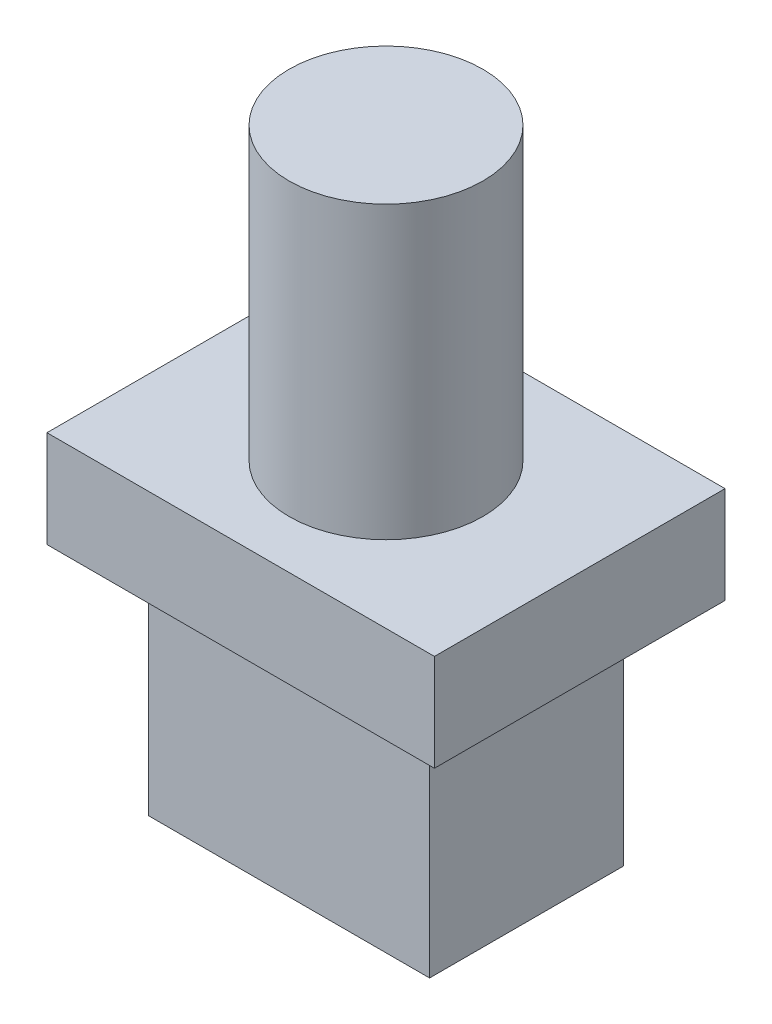
ISO-10303-21;
HEADER;
FILE_DESCRIPTION(('STEP AP214'),'2;1');
FILE_NAME('part.step','',(''),(''),'','','');
FILE_SCHEMA(('AUTOMOTIVE_DESIGN { 1 0 10303 214 1 1 1 1 }'));
ENDSEC;
DATA;
#1=APPLICATION_CONTEXT('core data for automotive mechanical design processes');
#2=APPLICATION_PROTOCOL_DEFINITION('international standard','automotive_design',2000,#1);
#3=PRODUCT_CONTEXT('',#1,'mechanical');
#4=PRODUCT('Part','Part','',(#3));
#5=PRODUCT_RELATED_PRODUCT_CATEGORY('part','',(#4));
#6=PRODUCT_DEFINITION_FORMATION('','',#4);
#7=PRODUCT_DEFINITION_CONTEXT('part definition',#1,'design');
#8=PRODUCT_DEFINITION('design','',#6,#7);
#9=PRODUCT_DEFINITION_SHAPE('','',#8);
#10=(LENGTH_UNIT() NAMED_UNIT(*) SI_UNIT(.MILLI.,.METRE.));
#11=(NAMED_UNIT(*) PLANE_ANGLE_UNIT() SI_UNIT($,.RADIAN.));
#12=(NAMED_UNIT(*) SI_UNIT($,.STERADIAN.) SOLID_ANGLE_UNIT());
#13=UNCERTAINTY_MEASURE_WITH_UNIT(LENGTH_MEASURE(1.E-05),#10,'distance_accuracy_value','');
#14=(GEOMETRIC_REPRESENTATION_CONTEXT(3) GLOBAL_UNCERTAINTY_ASSIGNED_CONTEXT((#13)) GLOBAL_UNIT_ASSIGNED_CONTEXT((#10,
#11,#12)) REPRESENTATION_CONTEXT('',''));
#15=CARTESIAN_POINT('',(0.,0.,0.));
#16=DIRECTION('',(0.,0.,1.));
#17=DIRECTION('',(1.,0.,0.));
#18=AXIS2_PLACEMENT_3D('',#15,#16,#17);
#19=CARTESIAN_POINT('',(0.,24.,-20.));
#20=DIRECTION('',(1.,0.,0.));
#21=DIRECTION('',(0.,0.,-1.));
#22=AXIS2_PLACEMENT_3D('',#19,#20,#21);
#23=PLANE('',#22);
#24=DIRECTION('',(0.,0.,1.));
#25=VECTOR('',#24,1.);
#26=CARTESIAN_POINT('',(0.,0.,-20.));
#27=LINE('',#26,#25);
#28=CARTESIAN_POINT('',(0.,0.,-20.));
#29=VERTEX_POINT('',#28);
#30=CARTESIAN_POINT('',(0.,0.,0.));
#31=VERTEX_POINT('',#30);
#32=EDGE_CURVE('E139',#29,#31,#27,.T.);
#33=ORIENTED_EDGE('',*,*,#32,.T.);
#34=DIRECTION('',(0.,-1.,0.));
#35=VECTOR('',#34,1.);
#36=CARTESIAN_POINT('',(0.,24.,0.));
#37=LINE('',#36,#35);
#38=CARTESIAN_POINT('',(0.,24.,0.));
#39=VERTEX_POINT('',#38);
#40=EDGE_CURVE('E42',#39,#31,#37,.T.);
#41=ORIENTED_EDGE('',*,*,#40,.F.);
#42=DIRECTION('',(0.,0.,1.));
#43=VECTOR('',#42,1.);
#44=CARTESIAN_POINT('',(0.,24.,-20.));
#45=LINE('',#44,#43);
#46=CARTESIAN_POINT('',(0.,24.,-20.));
#47=VERTEX_POINT('',#46);
#48=EDGE_CURVE('E148',#47,#39,#45,.T.);
#49=ORIENTED_EDGE('',*,*,#48,.F.);
#50=DIRECTION('',(0.,-1.,0.));
#51=VECTOR('',#50,1.);
#52=CARTESIAN_POINT('',(0.,24.,-20.));
#53=LINE('',#52,#51);
#54=EDGE_CURVE('E157',#47,#29,#53,.T.);
#55=ORIENTED_EDGE('',*,*,#54,.T.);
#56=EDGE_LOOP('',(#33,#41,#49,#55));
#57=FACE_BOUND('',#56,.T.);
#58=ADVANCED_FACE('F39',(#57),#23,.F.);
#59=CARTESIAN_POINT('',(0.,24.,0.));
#60=DIRECTION('',(0.,0.,-1.));
#61=DIRECTION('',(-1.,0.,0.));
#62=AXIS2_PLACEMENT_3D('',#59,#60,#61);
#63=PLANE('',#62);
#64=DIRECTION('',(1.,0.,0.));
#65=VECTOR('',#64,1.);
#66=CARTESIAN_POINT('',(0.,0.,0.));
#67=LINE('',#66,#65);
#68=CARTESIAN_POINT('',(29.,0.,0.));
#69=VERTEX_POINT('',#68);
#70=EDGE_CURVE('E142',#31,#69,#67,.T.);
#71=ORIENTED_EDGE('',*,*,#70,.T.);
#72=DIRECTION('',(0.,-1.,0.));
#73=VECTOR('',#72,1.);
#74=CARTESIAN_POINT('',(29.,24.,0.));
#75=LINE('',#74,#73);
#76=CARTESIAN_POINT('',(29.,24.,0.));
#77=VERTEX_POINT('',#76);
#78=EDGE_CURVE('E163',#77,#69,#75,.T.);
#79=ORIENTED_EDGE('',*,*,#78,.F.);
#80=DIRECTION('',(1.,0.,0.));
#81=VECTOR('',#80,1.);
#82=CARTESIAN_POINT('',(0.,24.,0.));
#83=LINE('',#82,#81);
#84=EDGE_CURVE('E83',#39,#77,#83,.T.);
#85=ORIENTED_EDGE('',*,*,#84,.F.);
#86=ORIENTED_EDGE('',*,*,#40,.T.);
#87=EDGE_LOOP('',(#71,#79,#85,#86));
#88=FACE_BOUND('',#87,.T.);
#89=ADVANCED_FACE('F164',(#88),#63,.F.);
#90=CARTESIAN_POINT('',(29.,24.,0.));
#91=DIRECTION('',(-1.,0.,0.));
#92=DIRECTION('',(0.,0.,1.));
#93=AXIS2_PLACEMENT_3D('',#90,#91,#92);
#94=PLANE('',#93);
#95=DIRECTION('',(0.,0.,-1.));
#96=VECTOR('',#95,1.);
#97=CARTESIAN_POINT('',(29.,0.,0.));
#98=LINE('',#97,#96);
#99=CARTESIAN_POINT('',(29.,0.,-20.));
#100=VERTEX_POINT('',#99);
#101=EDGE_CURVE('E72',#69,#100,#98,.T.);
#102=ORIENTED_EDGE('',*,*,#101,.T.);
#103=DIRECTION('',(0.,-1.,0.));
#104=VECTOR('',#103,1.);
#105=CARTESIAN_POINT('',(29.,24.,-20.));
#106=LINE('',#105,#104);
#107=CARTESIAN_POINT('',(29.,24.,-20.));
#108=VERTEX_POINT('',#107);
#109=EDGE_CURVE('E56',#108,#100,#106,.T.);
#110=ORIENTED_EDGE('',*,*,#109,.F.);
#111=DIRECTION('',(0.,0.,-1.));
#112=VECTOR('',#111,1.);
#113=CARTESIAN_POINT('',(29.,24.,0.));
#114=LINE('',#113,#112);
#115=EDGE_CURVE('E152',#77,#108,#114,.T.);
#116=ORIENTED_EDGE('',*,*,#115,.F.);
#117=ORIENTED_EDGE('',*,*,#78,.T.);
#118=EDGE_LOOP('',(#102,#110,#116,#117));
#119=FACE_BOUND('',#118,.T.);
#120=ADVANCED_FACE('F179',(#119),#94,.F.);
#121=CARTESIAN_POINT('',(29.,24.,-20.));
#122=DIRECTION('',(0.,0.,1.));
#123=DIRECTION('',(1.,0.,0.));
#124=AXIS2_PLACEMENT_3D('',#121,#122,#123);
#125=PLANE('',#124);
#126=DIRECTION('',(-1.,0.,0.));
#127=VECTOR('',#126,1.);
#128=CARTESIAN_POINT('',(29.,0.,-20.));
#129=LINE('',#128,#127);
#130=EDGE_CURVE('E77',#100,#29,#129,.T.);
#131=ORIENTED_EDGE('',*,*,#130,.T.);
#132=ORIENTED_EDGE('',*,*,#54,.F.);
#133=DIRECTION('',(-1.,0.,0.));
#134=VECTOR('',#133,1.);
#135=CARTESIAN_POINT('',(29.,24.,-20.));
#136=LINE('',#135,#134);
#137=EDGE_CURVE('E155',#108,#47,#136,.T.);
#138=ORIENTED_EDGE('',*,*,#137,.F.);
#139=ORIENTED_EDGE('',*,*,#109,.T.);
#140=EDGE_LOOP('',(#131,#132,#138,#139));
#141=FACE_BOUND('',#140,.T.);
#142=ADVANCED_FACE('F171',(#141),#125,.F.);
#143=CARTESIAN_POINT('',(0.,0.,0.));
#144=DIRECTION('',(0.,1.,0.));
#145=DIRECTION('',(0.,0.,1.));
#146=AXIS2_PLACEMENT_3D('',#143,#144,#145);
#147=PLANE('',#146);
#148=ORIENTED_EDGE('',*,*,#32,.F.);
#149=ORIENTED_EDGE('',*,*,#130,.F.);
#150=ORIENTED_EDGE('',*,*,#101,.F.);
#151=ORIENTED_EDGE('',*,*,#70,.F.);
#152=EDGE_LOOP('',(#148,#149,#150,#151));
#153=FACE_BOUND('',#152,.T.);
#154=ADVANCED_FACE('F168',(#153),#147,.F.);
#155=CARTESIAN_POINT('',(0.,24.,0.));
#156=DIRECTION('',(0.,1.,0.));
#157=DIRECTION('',(0.,0.,1.));
#158=AXIS2_PLACEMENT_3D('',#155,#156,#157);
#159=PLANE('',#158);
#160=DIRECTION('',(1.,0.,0.));
#161=VECTOR('',#160,1.);
#162=CARTESIAN_POINT('',(0.,24.,5.));
#163=LINE('',#162,#161);
#164=CARTESIAN_POINT('',(-5.49999999999999,24.,5.));
#165=VERTEX_POINT('',#164);
#166=CARTESIAN_POINT('',(34.5,24.,5.));
#167=VERTEX_POINT('',#166);
#168=EDGE_CURVE('E138',#165,#167,#163,.T.);
#169=ORIENTED_EDGE('',*,*,#168,.F.);
#170=DIRECTION('',(0.,0.,1.));
#171=VECTOR('',#170,1.);
#172=CARTESIAN_POINT('',(-5.5,24.,0.));
#173=LINE('',#172,#171);
#174=CARTESIAN_POINT('',(-5.5,24.,-25.));
#175=VERTEX_POINT('',#174);
#176=EDGE_CURVE('E134',#175,#165,#173,.T.);
#177=ORIENTED_EDGE('',*,*,#176,.F.);
#178=DIRECTION('',(-1.,0.,0.));
#179=VECTOR('',#178,1.);
#180=CARTESIAN_POINT('',(0.,24.,-25.));
#181=LINE('',#180,#179);
#182=CARTESIAN_POINT('',(34.5,24.,-25.));
#183=VERTEX_POINT('',#182);
#184=EDGE_CURVE('E339',#183,#175,#181,.T.);
#185=ORIENTED_EDGE('',*,*,#184,.F.);
#186=DIRECTION('',(0.,0.,-1.));
#187=VECTOR('',#186,1.);
#188=CARTESIAN_POINT('',(34.5,24.,0.));
#189=LINE('',#188,#187);
#190=EDGE_CURVE('E332',#167,#183,#189,.T.);
#191=ORIENTED_EDGE('',*,*,#190,.F.);
#192=EDGE_LOOP('',(#169,#177,#185,#191));
#193=FACE_BOUND('',#192,.T.);
#194=ORIENTED_EDGE('',*,*,#137,.T.);
#195=ORIENTED_EDGE('',*,*,#48,.T.);
#196=ORIENTED_EDGE('',*,*,#84,.T.);
#197=ORIENTED_EDGE('',*,*,#115,.T.);
#198=EDGE_LOOP('',(#194,#195,#196,#197));
#199=FACE_BOUND('',#198,.T.);
#200=ADVANCED_FACE('F170',(#193,#199),#159,.F.);
#201=CARTESIAN_POINT('',(0.,34.,5.));
#202=DIRECTION('',(0.,0.,-1.));
#203=DIRECTION('',(-1.,0.,0.));
#204=AXIS2_PLACEMENT_3D('',#201,#202,#203);
#205=PLANE('',#204);
#206=ORIENTED_EDGE('',*,*,#168,.T.);
#207=DIRECTION('',(0.,-1.,0.));
#208=VECTOR('',#207,1.);
#209=CARTESIAN_POINT('',(34.5,34.,5.));
#210=LINE('',#209,#208);
#211=CARTESIAN_POINT('',(34.5,34.,5.));
#212=VERTEX_POINT('',#211);
#213=EDGE_CURVE('E118',#212,#167,#210,.T.);
#214=ORIENTED_EDGE('',*,*,#213,.F.);
#215=DIRECTION('',(1.,0.,0.));
#216=VECTOR('',#215,1.);
#217=CARTESIAN_POINT('',(0.,34.,5.));
#218=LINE('',#217,#216);
#219=CARTESIAN_POINT('',(-5.49999999999999,34.,5.));
#220=VERTEX_POINT('',#219);
#221=EDGE_CURVE('E125',#220,#212,#218,.T.);
#222=ORIENTED_EDGE('',*,*,#221,.F.);
#223=DIRECTION('',(0.,-1.,0.));
#224=VECTOR('',#223,1.);
#225=CARTESIAN_POINT('',(-5.49999999999999,34.,5.));
#226=LINE('',#225,#224);
#227=EDGE_CURVE('E336',#220,#165,#226,.T.);
#228=ORIENTED_EDGE('',*,*,#227,.T.);
#229=EDGE_LOOP('',(#206,#214,#222,#228));
#230=FACE_BOUND('',#229,.T.);
#231=ADVANCED_FACE('F136',(#230),#205,.F.);
#232=CARTESIAN_POINT('',(34.5,34.,0.));
#233=DIRECTION('',(-1.,0.,0.));
#234=DIRECTION('',(0.,0.,1.));
#235=AXIS2_PLACEMENT_3D('',#232,#233,#234);
#236=PLANE('',#235);
#237=ORIENTED_EDGE('',*,*,#190,.T.);
#238=DIRECTION('',(0.,-1.,0.));
#239=VECTOR('',#238,1.);
#240=CARTESIAN_POINT('',(34.5,34.,-25.));
#241=LINE('',#240,#239);
#242=CARTESIAN_POINT('',(34.5,34.,-25.));
#243=VERTEX_POINT('',#242);
#244=EDGE_CURVE('E121',#243,#183,#241,.T.);
#245=ORIENTED_EDGE('',*,*,#244,.F.);
#246=DIRECTION('',(0.,0.,-1.));
#247=VECTOR('',#246,1.);
#248=CARTESIAN_POINT('',(34.5,34.,0.));
#249=LINE('',#248,#247);
#250=EDGE_CURVE('E114',#212,#243,#249,.T.);
#251=ORIENTED_EDGE('',*,*,#250,.F.);
#252=ORIENTED_EDGE('',*,*,#213,.T.);
#253=EDGE_LOOP('',(#237,#245,#251,#252));
#254=FACE_BOUND('',#253,.T.);
#255=ADVANCED_FACE('F116',(#254),#236,.F.);
#256=CARTESIAN_POINT('',(0.,34.,-25.));
#257=DIRECTION('',(0.,0.,1.));
#258=DIRECTION('',(1.,0.,0.));
#259=AXIS2_PLACEMENT_3D('',#256,#257,#258);
#260=PLANE('',#259);
#261=ORIENTED_EDGE('',*,*,#184,.T.);
#262=DIRECTION('',(0.,-1.,0.));
#263=VECTOR('',#262,1.);
#264=CARTESIAN_POINT('',(-5.5,34.,-25.));
#265=LINE('',#264,#263);
#266=CARTESIAN_POINT('',(-5.5,34.,-25.));
#267=VERTEX_POINT('',#266);
#268=EDGE_CURVE('E144',#267,#175,#265,.T.);
#269=ORIENTED_EDGE('',*,*,#268,.F.);
#270=DIRECTION('',(-1.,0.,0.));
#271=VECTOR('',#270,1.);
#272=CARTESIAN_POINT('',(0.,34.,-25.));
#273=LINE('',#272,#271);
#274=EDGE_CURVE('E124',#243,#267,#273,.T.);
#275=ORIENTED_EDGE('',*,*,#274,.F.);
#276=ORIENTED_EDGE('',*,*,#244,.T.);
#277=EDGE_LOOP('',(#261,#269,#275,#276));
#278=FACE_BOUND('',#277,.T.);
#279=ADVANCED_FACE('F223',(#278),#260,.F.);
#280=CARTESIAN_POINT('',(-5.5,34.,0.));
#281=DIRECTION('',(1.,0.,0.));
#282=DIRECTION('',(0.,0.,-1.));
#283=AXIS2_PLACEMENT_3D('',#280,#281,#282);
#284=PLANE('',#283);
#285=ORIENTED_EDGE('',*,*,#176,.T.);
#286=ORIENTED_EDGE('',*,*,#227,.F.);
#287=DIRECTION('',(0.,0.,1.));
#288=VECTOR('',#287,1.);
#289=CARTESIAN_POINT('',(-5.5,34.,0.));
#290=LINE('',#289,#288);
#291=EDGE_CURVE('E130',#267,#220,#290,.T.);
#292=ORIENTED_EDGE('',*,*,#291,.F.);
#293=ORIENTED_EDGE('',*,*,#268,.T.);
#294=EDGE_LOOP('',(#285,#286,#292,#293));
#295=FACE_BOUND('',#294,.T.);
#296=ADVANCED_FACE('F232',(#295),#284,.F.);
#297=CARTESIAN_POINT('',(0.,34.,0.));
#298=DIRECTION('',(0.,1.,0.));
#299=DIRECTION('',(0.,0.,1.));
#300=AXIS2_PLACEMENT_3D('',#297,#298,#299);
#301=PLANE('',#300);
#302=CARTESIAN_POINT('',(14.5,34.,-9.99999999999999));
#303=DIRECTION('',(0.,1.,0.));
#304=DIRECTION('',(0.,0.,1.));
#305=AXIS2_PLACEMENT_3D('',#302,#303,#304);
#306=CIRCLE('',#305,10.);
#307=CARTESIAN_POINT('',(14.5,34.,0.));
#308=VERTEX_POINT('',#307);
#309=EDGE_CURVE('E11',#308,#308,#306,.T.);
#310=ORIENTED_EDGE('',*,*,#309,.F.);
#311=EDGE_LOOP('',(#310));
#312=FACE_BOUND('',#311,.T.);
#313=ORIENTED_EDGE('',*,*,#221,.T.);
#314=ORIENTED_EDGE('',*,*,#250,.T.);
#315=ORIENTED_EDGE('',*,*,#274,.T.);
#316=ORIENTED_EDGE('',*,*,#291,.T.);
#317=EDGE_LOOP('',(#313,#314,#315,#316));
#318=FACE_BOUND('',#317,.T.);
#319=ADVANCED_FACE('F128',(#312,#318),#301,.T.);
#320=CARTESIAN_POINT('',(14.5,64.,-9.99999999999999));
#321=DIRECTION('',(0.,-1.,0.));
#322=DIRECTION('',(0.,0.,-1.));
#323=AXIS2_PLACEMENT_3D('',#320,#321,#322);
#324=CYLINDRICAL_SURFACE('',#323,10.);
#325=CARTESIAN_POINT('',(14.5,64.,-9.99999999999999));
#326=DIRECTION('',(0.,1.,0.));
#327=DIRECTION('',(0.,0.,1.));
#328=AXIS2_PLACEMENT_3D('',#325,#326,#327);
#329=CIRCLE('',#328,10.);
#330=CARTESIAN_POINT('',(14.5,64.,0.));
#331=VERTEX_POINT('',#330);
#332=EDGE_CURVE('E330',#331,#331,#329,.T.);
#333=ORIENTED_EDGE('',*,*,#332,.F.);
#334=EDGE_LOOP('',(#333));
#335=FACE_BOUND('',#334,.T.);
#336=ORIENTED_EDGE('',*,*,#309,.T.);
#337=EDGE_LOOP('',(#336));
#338=FACE_BOUND('',#337,.T.);
#339=ADVANCED_FACE('F254',(#335,#338),#324,.T.);
#340=CARTESIAN_POINT('',(0.,64.,0.));
#341=DIRECTION('',(0.,1.,0.));
#342=DIRECTION('',(0.,0.,1.));
#343=AXIS2_PLACEMENT_3D('',#340,#341,#342);
#344=PLANE('',#343);
#345=ORIENTED_EDGE('',*,*,#332,.T.);
#346=EDGE_LOOP('',(#345));
#347=FACE_BOUND('',#346,.T.);
#348=ADVANCED_FACE('F264',(#347),#344,.T.);
#349=CLOSED_SHELL('',(#58,#89,#120,#142,#154,#200,#231,#255,#279,#296,#319,#339,#348));
#350=MANIFOLD_SOLID_BREP('B2',#349);
#351=ADVANCED_BREP_SHAPE_REPRESENTATION('',(#18,#350),#14);
#352=SHAPE_DEFINITION_REPRESENTATION(#9,#351);
ENDSEC;
END-ISO-10303-21;
